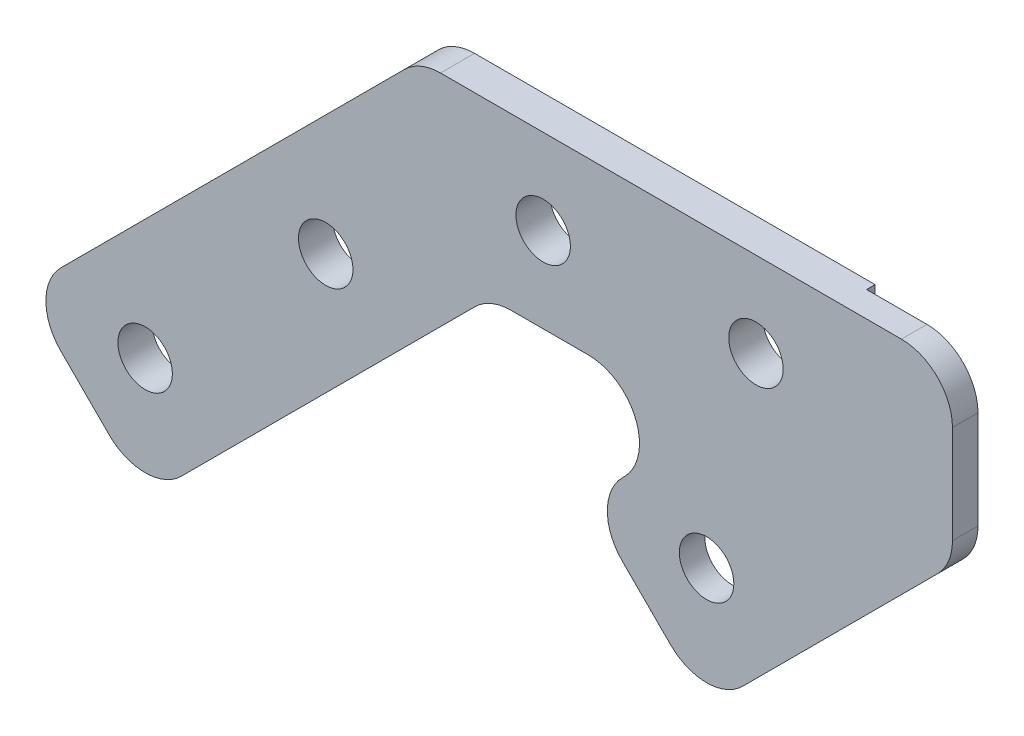
ISO-10303-21;
HEADER;
FILE_DESCRIPTION(('STEP AP214'),'2;1');
FILE_NAME('part.step','',(''),(''),'','','');
FILE_SCHEMA(('AUTOMOTIVE_DESIGN { 1 0 10303 214 1 1 1 1 }'));
ENDSEC;
DATA;
#1=APPLICATION_CONTEXT('core data for automotive mechanical design processes');
#2=APPLICATION_PROTOCOL_DEFINITION('international standard','automotive_design',2000,#1);
#3=PRODUCT_CONTEXT('',#1,'mechanical');
#4=PRODUCT('Part','Part','',(#3));
#5=PRODUCT_RELATED_PRODUCT_CATEGORY('part','',(#4));
#6=PRODUCT_DEFINITION_FORMATION('','',#4);
#7=PRODUCT_DEFINITION_CONTEXT('part definition',#1,'design');
#8=PRODUCT_DEFINITION('design','',#6,#7);
#9=PRODUCT_DEFINITION_SHAPE('','',#8);
#10=(LENGTH_UNIT() NAMED_UNIT(*) SI_UNIT(.MILLI.,.METRE.));
#11=(NAMED_UNIT(*) PLANE_ANGLE_UNIT() SI_UNIT($,.RADIAN.));
#12=(NAMED_UNIT(*) SI_UNIT($,.STERADIAN.) SOLID_ANGLE_UNIT());
#13=UNCERTAINTY_MEASURE_WITH_UNIT(LENGTH_MEASURE(1.E-05),#10,'distance_accuracy_value','');
#14=(GEOMETRIC_REPRESENTATION_CONTEXT(3) GLOBAL_UNCERTAINTY_ASSIGNED_CONTEXT((#13)) GLOBAL_UNIT_ASSIGNED_CONTEXT((#10,
#11,#12)) REPRESENTATION_CONTEXT('',''));
#15=CARTESIAN_POINT('',(0.,0.,0.));
#16=DIRECTION('',(0.,0.,1.));
#17=DIRECTION('',(1.,0.,0.));
#18=AXIS2_PLACEMENT_3D('',#15,#16,#17);
#19=CARTESIAN_POINT('',(0.,0.,2.));
#20=DIRECTION('',(0.,1.,0.));
#21=DIRECTION('',(-1.,0.,0.));
#22=AXIS2_PLACEMENT_3D('',#19,#20,#21);
#23=PLANE('',#22);
#24=DIRECTION('',(1.,0.,0.));
#25=VECTOR('',#24,1.);
#26=CARTESIAN_POINT('',(0.,0.,2.));
#27=LINE('',#26,#25);
#28=CARTESIAN_POINT('',(1.24264068711928,0.,2.));
#29=VERTEX_POINT('',#28);
#30=CARTESIAN_POINT('',(5.78629150101195,0.,2.));
#31=VERTEX_POINT('',#30);
#32=EDGE_CURVE('E283',#29,#31,#27,.T.);
#33=ORIENTED_EDGE('',*,*,#32,.F.);
#34=DIRECTION('',(0.,0.,-1.));
#35=VECTOR('',#34,1.);
#36=CARTESIAN_POINT('',(1.24264068711928,0.,0.));
#37=LINE('',#36,#35);
#38=CARTESIAN_POINT('',(1.24264068711928,0.,0.));
#39=VERTEX_POINT('',#38);
#40=EDGE_CURVE('E271',#29,#39,#37,.T.);
#41=ORIENTED_EDGE('',*,*,#40,.T.);
#42=DIRECTION('',(1.,0.,0.));
#43=VECTOR('',#42,1.);
#44=CARTESIAN_POINT('',(0.,0.,0.));
#45=LINE('',#44,#43);
#46=CARTESIAN_POINT('',(20.6289321881429,0.,0.));
#47=VERTEX_POINT('',#46);
#48=EDGE_CURVE('E197',#39,#47,#45,.T.);
#49=ORIENTED_EDGE('',*,*,#48,.T.);
#50=DIRECTION('',(0.,0.,-1.));
#51=VECTOR('',#50,1.);
#52=CARTESIAN_POINT('',(20.6289321881429,0.,2.));
#53=LINE('',#52,#51);
#54=CARTESIAN_POINT('',(20.6289321881429,0.,0.5));
#55=VERTEX_POINT('',#54);
#56=EDGE_CURVE('E189',#55,#47,#53,.T.);
#57=ORIENTED_EDGE('',*,*,#56,.F.);
#58=DIRECTION('',(1.,0.,0.));
#59=VECTOR('',#58,1.);
#60=CARTESIAN_POINT('',(0.,0.,0.5));
#61=LINE('',#60,#59);
#62=CARTESIAN_POINT('',(5.78629150101195,0.,0.5));
#63=VERTEX_POINT('',#62);
#64=EDGE_CURVE('E52',#63,#55,#61,.T.);
#65=ORIENTED_EDGE('',*,*,#64,.F.);
#66=DIRECTION('',(0.,0.,1.));
#67=VECTOR('',#66,1.);
#68=CARTESIAN_POINT('',(5.78629150101195,0.,2.));
#69=LINE('',#68,#67);
#70=EDGE_CURVE('E269',#63,#31,#69,.T.);
#71=ORIENTED_EDGE('',*,*,#70,.T.);
#72=EDGE_LOOP('',(#33,#41,#49,#57,#65,#71));
#73=FACE_BOUND('',#72,.T.);
#74=ADVANCED_FACE('F37',(#73),#23,.F.);
#75=CARTESIAN_POINT('',(20.6289321881429,0.,2.));
#76=DIRECTION('',(-1.,0.,0.));
#77=DIRECTION('',(0.,0.,1.));
#78=AXIS2_PLACEMENT_3D('',#75,#76,#77);
#79=PLANE('',#78);
#80=DIRECTION('',(0.,1.,0.));
#81=VECTOR('',#80,1.);
#82=CARTESIAN_POINT('',(20.6289321881429,0.,0.5));
#83=LINE('',#82,#81);
#84=CARTESIAN_POINT('',(20.6289321881429,10.,0.5));
#85=VERTEX_POINT('',#84);
#86=EDGE_CURVE('E179',#55,#85,#83,.T.);
#87=ORIENTED_EDGE('',*,*,#86,.F.);
#88=ORIENTED_EDGE('',*,*,#56,.T.);
#89=DIRECTION('',(0.,1.,0.));
#90=VECTOR('',#89,1.);
#91=CARTESIAN_POINT('',(20.6289321881429,0.,0.));
#92=LINE('',#91,#90);
#93=CARTESIAN_POINT('',(20.6289321881429,10.,0.));
#94=VERTEX_POINT('',#93);
#95=EDGE_CURVE('E310',#47,#94,#92,.T.);
#96=ORIENTED_EDGE('',*,*,#95,.T.);
#97=DIRECTION('',(0.,0.,-1.));
#98=VECTOR('',#97,1.);
#99=CARTESIAN_POINT('',(20.6289321881429,10.,2.));
#100=LINE('',#99,#98);
#101=EDGE_CURVE('E191',#85,#94,#100,.T.);
#102=ORIENTED_EDGE('',*,*,#101,.F.);
#103=EDGE_LOOP('',(#87,#88,#96,#102));
#104=FACE_BOUND('',#103,.T.);
#105=ADVANCED_FACE('F187',(#104),#79,.F.);
#106=CARTESIAN_POINT('',(0.,0.,2.));
#107=DIRECTION('',(0.,0.,1.));
#108=DIRECTION('',(1.,0.,0.));
#109=AXIS2_PLACEMENT_3D('',#106,#107,#108);
#110=PLANE('',#109);
#111=CARTESIAN_POINT('',(-20.2512626584666,-13.1801948466011,2.));
#112=DIRECTION('',(0.,0.,1.));
#113=DIRECTION('',(1.,0.,0.));
#114=AXIS2_PLACEMENT_3D('',#111,#112,#113);
#115=CIRCLE('',#114,1.6);
#116=CARTESIAN_POINT('',(-18.6512626584666,-13.1801948466011,2.));
#117=VERTEX_POINT('',#116);
#118=EDGE_CURVE('E349',#117,#117,#115,.T.);
#119=ORIENTED_EDGE('',*,*,#118,.F.);
#120=EDGE_LOOP('',(#119));
#121=FACE_BOUND('',#120,.T.);
#122=CARTESIAN_POINT('',(3.12893218814291,5.,2.));
#123=DIRECTION('',(0.,0.,1.));
#124=DIRECTION('',(1.,0.,0.));
#125=AXIS2_PLACEMENT_3D('',#122,#123,#124);
#126=CIRCLE('',#125,1.6);
#127=CARTESIAN_POINT('',(4.72893218814291,5.,2.));
#128=VERTEX_POINT('',#127);
#129=EDGE_CURVE('E336',#128,#128,#126,.T.);
#130=ORIENTED_EDGE('',*,*,#129,.F.);
#131=EDGE_LOOP('',(#130));
#132=FACE_BOUND('',#131,.T.);
#133=DIRECTION('',(0.707106781186547,-0.707106781186547,0.));
#134=VECTOR('',#133,1.);
#135=CARTESIAN_POINT('',(-27.3223304703321,-13.1801948466011,2.));
#136=LINE('',#135,#134);
#137=CARTESIAN_POINT('',(-25.2010101267724,-15.3015151901607,2.));
#138=VERTEX_POINT('',#137);
#139=CARTESIAN_POINT('',(-22.3725830020262,-18.1299423149069,2.));
#140=VERTEX_POINT('',#139);
#141=EDGE_CURVE('E324',#138,#140,#136,.T.);
#142=ORIENTED_EDGE('',*,*,#141,.T.);
#143=CARTESIAN_POINT('',(-20.2512626584666,-16.0086219713473,2.));
#144=DIRECTION('',(0.,0.,1.));
#145=DIRECTION('',(1.,0.,0.));
#146=AXIS2_PLACEMENT_3D('',#143,#144,#145);
#147=CIRCLE('',#146,3.);
#148=CARTESIAN_POINT('',(-18.1299423149069,-18.1299423149069,2.));
#149=VERTEX_POINT('',#148);
#150=EDGE_CURVE('E231',#140,#149,#147,.T.);
#151=ORIENTED_EDGE('',*,*,#150,.T.);
#152=DIRECTION('',(0.707106781186548,0.707106781186548,0.));
#153=VECTOR('',#152,1.);
#154=CARTESIAN_POINT('',(-20.2512626584666,-20.2512626584666,2.));
#155=LINE('',#154,#153);
#156=CARTESIAN_POINT('',(-0.878679656440354,-0.878679656440354,2.));
#157=VERTEX_POINT('',#156);
#158=EDGE_CURVE('E291',#149,#157,#155,.T.);
#159=ORIENTED_EDGE('',*,*,#158,.T.);
#160=CARTESIAN_POINT('',(1.24264068711928,-3.,2.));
#161=DIRECTION('',(0.,0.,1.));
#162=DIRECTION('',(1.,0.,0.));
#163=AXIS2_PLACEMENT_3D('',#160,#161,#162);
#164=CIRCLE('',#163,3.);
#165=EDGE_CURVE('E275',#157,#29,#164,.F.);
#166=ORIENTED_EDGE('',*,*,#165,.T.);
#167=ORIENTED_EDGE('',*,*,#32,.T.);
#168=CARTESIAN_POINT('',(5.78629150101195,-3.,2.));
#169=DIRECTION('',(0.,0.,1.));
#170=DIRECTION('',(1.,0.,0.));
#171=AXIS2_PLACEMENT_3D('',#168,#169,#170);
#172=CIRCLE('',#171,3.);
#173=CARTESIAN_POINT('',(7.90761184457165,-5.12132034355958,2.));
#174=VERTEX_POINT('',#173);
#175=EDGE_CURVE('E45',#31,#174,#172,.F.);
#176=ORIENTED_EDGE('',*,*,#175,.T.);
#177=DIRECTION('',(0.707106781186528,0.707106781186567,0.));
#178=VECTOR('',#177,1.);
#179=CARTESIAN_POINT('',(6.51446609406584,-6.51446609406548,2.));
#180=LINE('',#179,#178);
#181=CARTESIAN_POINT('',(7.7776695296604,-5.25126265847084,2.));
#182=VERTEX_POINT('',#181);
#183=EDGE_CURVE('E282',#182,#174,#180,.T.);
#184=ORIENTED_EDGE('',*,*,#183,.F.);
#185=CARTESIAN_POINT('',(9.8989898732201,-7.37258300203043,2.));
#186=DIRECTION('',(0.,0.,1.));
#187=DIRECTION('',(1.,0.,0.));
#188=AXIS2_PLACEMENT_3D('',#185,#186,#187);
#189=CIRCLE('',#188,3.);
#190=CARTESIAN_POINT('',(7.77766952966047,-9.49390334559008,2.));
#191=VERTEX_POINT('',#190);
#192=EDGE_CURVE('E219',#182,#191,#189,.T.);
#193=ORIENTED_EDGE('',*,*,#192,.T.);
#194=DIRECTION('',(0.707106781186551,-0.707106781186544,0.));
#195=VECTOR('',#194,1.);
#196=CARTESIAN_POINT('',(-0.858116907964844,-0.858116907964853,2.));
#197=LINE('',#196,#195);
#198=CARTESIAN_POINT('',(10.6060966544068,-12.3223304703363,2.));
#199=VERTEX_POINT('',#198);
#200=EDGE_CURVE('E287',#191,#199,#197,.T.);
#201=ORIENTED_EDGE('',*,*,#200,.T.);
#202=CARTESIAN_POINT('',(12.7274169979664,-10.2010101267767,2.));
#203=DIRECTION('',(0.,0.,1.));
#204=DIRECTION('',(1.,0.,0.));
#205=AXIS2_PLACEMENT_3D('',#202,#203,#204);
#206=CIRCLE('',#205,3.);
#207=CARTESIAN_POINT('',(14.848737341526,-12.3223304703363,2.));
#208=VERTEX_POINT('',#207);
#209=EDGE_CURVE('E221',#199,#208,#206,.T.);
#210=ORIENTED_EDGE('',*,*,#209,.T.);
#211=DIRECTION('',(0.707106781186542,0.707106781186553,0.));
#212=VECTOR('',#211,1.);
#213=CARTESIAN_POINT('',(13.5855339059313,-13.5855339059311,2.));
#214=LINE('',#213,#212);
#215=CARTESIAN_POINT('',(26.2923881554221,-0.878679656440005,2.));
#216=VERTEX_POINT('',#215);
#217=EDGE_CURVE('E364',#208,#216,#214,.T.);
#218=ORIENTED_EDGE('',*,*,#217,.T.);
#219=CARTESIAN_POINT('',(24.1710678118625,1.24264068711962,2.));
#220=DIRECTION('',(0.,0.,1.));
#221=DIRECTION('',(1.,0.,0.));
#222=AXIS2_PLACEMENT_3D('',#219,#220,#221);
#223=CIRCLE('',#222,3.);
#224=CARTESIAN_POINT('',(27.1710678118625,1.24264068711962,2.));
#225=VERTEX_POINT('',#224);
#226=EDGE_CURVE('E225',#216,#225,#223,.T.);
#227=ORIENTED_EDGE('',*,*,#226,.T.);
#228=DIRECTION('',(0.,1.,0.));
#229=VECTOR('',#228,1.);
#230=CARTESIAN_POINT('',(27.1710678118625,0.,2.));
#231=LINE('',#230,#229);
#232=CARTESIAN_POINT('',(27.1710678118625,7.,2.));
#233=VERTEX_POINT('',#232);
#234=EDGE_CURVE('E288',#225,#233,#231,.T.);
#235=ORIENTED_EDGE('',*,*,#234,.T.);
#236=CARTESIAN_POINT('',(24.1710678118625,7.,2.));
#237=DIRECTION('',(0.,0.,1.));
#238=DIRECTION('',(1.,0.,0.));
#239=AXIS2_PLACEMENT_3D('',#236,#237,#238);
#240=CIRCLE('',#239,3.);
#241=CARTESIAN_POINT('',(24.1710678118625,10.,2.));
#242=VERTEX_POINT('',#241);
#243=EDGE_CURVE('E223',#233,#242,#240,.T.);
#244=ORIENTED_EDGE('',*,*,#243,.T.);
#245=DIRECTION('',(-1.,0.,0.));
#246=VECTOR('',#245,1.);
#247=CARTESIAN_POINT('',(20.6289321881429,10.,2.));
#248=LINE('',#247,#246);
#249=CARTESIAN_POINT('',(-2.89949493661167,9.99999999999999,2.));
#250=VERTEX_POINT('',#249);
#251=EDGE_CURVE('E202',#242,#250,#248,.T.);
#252=ORIENTED_EDGE('',*,*,#251,.T.);
#253=CARTESIAN_POINT('',(-2.89949493661167,6.99999999999999,2.));
#254=DIRECTION('',(0.,0.,1.));
#255=DIRECTION('',(1.,0.,0.));
#256=AXIS2_PLACEMENT_3D('',#253,#254,#255);
#257=CIRCLE('',#256,3.);
#258=CARTESIAN_POINT('',(-5.02081528017131,9.12132034355964,2.));
#259=VERTEX_POINT('',#258);
#260=EDGE_CURVE('E227',#250,#259,#257,.T.);
#261=ORIENTED_EDGE('',*,*,#260,.T.);
#262=DIRECTION('',(-0.707106781186548,-0.707106781186548,0.));
#263=VECTOR('',#262,1.);
#264=CARTESIAN_POINT('',(-4.14213562373095,9.99999999999999,2.));
#265=LINE('',#264,#263);
#266=CARTESIAN_POINT('',(-25.2010101267724,-11.0588745030415,2.));
#267=VERTEX_POINT('',#266);
#268=EDGE_CURVE('E319',#259,#267,#265,.T.);
#269=ORIENTED_EDGE('',*,*,#268,.T.);
#270=CARTESIAN_POINT('',(-23.0796897832128,-13.1801948466011,2.));
#271=DIRECTION('',(0.,0.,1.));
#272=DIRECTION('',(1.,0.,0.));
#273=AXIS2_PLACEMENT_3D('',#270,#271,#272);
#274=CIRCLE('',#273,3.);
#275=EDGE_CURVE('E229',#267,#138,#274,.T.);
#276=ORIENTED_EDGE('',*,*,#275,.T.);
#277=EDGE_LOOP('',(#142,#151,#159,#166,#167,#176,#184,#193,#201,#210,#218,#227,#235,#244,#252,
#261,#269,#276));
#278=FACE_BOUND('',#277,.T.);
#279=CARTESIAN_POINT('',(15.6289321881429,5.,2.));
#280=DIRECTION('',(0.,0.,1.));
#281=DIRECTION('',(1.,0.,0.));
#282=AXIS2_PLACEMENT_3D('',#279,#280,#281);
#283=CIRCLE('',#282,1.6);
#284=CARTESIAN_POINT('',(17.2289321881429,5.,2.));
#285=VERTEX_POINT('',#284);
#286=EDGE_CURVE('E344',#285,#285,#283,.T.);
#287=ORIENTED_EDGE('',*,*,#286,.F.);
#288=EDGE_LOOP('',(#287));
#289=FACE_BOUND('',#288,.T.);
#290=CARTESIAN_POINT('',(-9.64466094066837,-2.57359312880289,2.));
#291=DIRECTION('',(0.,0.,1.));
#292=DIRECTION('',(1.,0.,0.));
#293=AXIS2_PLACEMENT_3D('',#290,#291,#292);
#294=CIRCLE('',#293,1.6);
#295=CARTESIAN_POINT('',(-8.04466094066837,-2.57359312880289,2.));
#296=VERTEX_POINT('',#295);
#297=EDGE_CURVE('E355',#296,#296,#294,.T.);
#298=ORIENTED_EDGE('',*,*,#297,.F.);
#299=EDGE_LOOP('',(#298));
#300=FACE_BOUND('',#299,.T.);
#301=CARTESIAN_POINT('',(12.7274169979661,-7.37258300203105,2.));
#302=DIRECTION('',(0.,0.,1.));
#303=DIRECTION('',(1.,0.,0.));
#304=AXIS2_PLACEMENT_3D('',#301,#302,#303);
#305=CIRCLE('',#304,1.60000000000019);
#306=CARTESIAN_POINT('',(14.3274169979663,-7.37258300203105,2.));
#307=VERTEX_POINT('',#306);
#308=EDGE_CURVE('E372',#307,#307,#305,.T.);
#309=ORIENTED_EDGE('',*,*,#308,.F.);
#310=EDGE_LOOP('',(#309));
#311=FACE_BOUND('',#310,.T.);
#312=ADVANCED_FACE('F280',(#121,#132,#278,#289,#300,#311),#110,.T.);
#313=CARTESIAN_POINT('',(0.,0.,0.));
#314=DIRECTION('',(0.,0.,1.));
#315=DIRECTION('',(1.,0.,0.));
#316=AXIS2_PLACEMENT_3D('',#313,#314,#315);
#317=PLANE('',#316);
#318=DIRECTION('',(0.707106781186548,0.707106781186548,0.));
#319=VECTOR('',#318,1.);
#320=CARTESIAN_POINT('',(-20.2512626584666,-20.2512626584666,0.));
#321=LINE('',#320,#319);
#322=CARTESIAN_POINT('',(-18.1299423149069,-18.1299423149069,0.));
#323=VERTEX_POINT('',#322);
#324=CARTESIAN_POINT('',(-0.878679656440354,-0.878679656440354,0.));
#325=VERTEX_POINT('',#324);
#326=EDGE_CURVE('E302',#323,#325,#321,.T.);
#327=ORIENTED_EDGE('',*,*,#326,.F.);
#328=CARTESIAN_POINT('',(-20.2512626584666,-16.0086219713473,0.));
#329=DIRECTION('',(0.,0.,1.));
#330=DIRECTION('',(1.,0.,0.));
#331=AXIS2_PLACEMENT_3D('',#328,#329,#330);
#332=CIRCLE('',#331,3.);
#333=CARTESIAN_POINT('',(-22.3725830020262,-18.1299423149069,0.));
#334=VERTEX_POINT('',#333);
#335=EDGE_CURVE('E212',#323,#334,#332,.F.);
#336=ORIENTED_EDGE('',*,*,#335,.T.);
#337=DIRECTION('',(0.707106781186547,-0.707106781186547,0.));
#338=VECTOR('',#337,1.);
#339=CARTESIAN_POINT('',(-27.3223304703321,-13.1801948466011,0.));
#340=LINE('',#339,#338);
#341=CARTESIAN_POINT('',(-25.2010101267724,-15.3015151901607,0.));
#342=VERTEX_POINT('',#341);
#343=EDGE_CURVE('E308',#342,#334,#340,.T.);
#344=ORIENTED_EDGE('',*,*,#343,.F.);
#345=CARTESIAN_POINT('',(-23.0796897832128,-13.1801948466011,0.));
#346=DIRECTION('',(0.,0.,1.));
#347=DIRECTION('',(1.,0.,0.));
#348=AXIS2_PLACEMENT_3D('',#345,#346,#347);
#349=CIRCLE('',#348,3.);
#350=CARTESIAN_POINT('',(-25.2010101267724,-11.0588745030415,0.));
#351=VERTEX_POINT('',#350);
#352=EDGE_CURVE('E210',#342,#351,#349,.F.);
#353=ORIENTED_EDGE('',*,*,#352,.T.);
#354=DIRECTION('',(-0.707106781186548,-0.707106781186548,0.));
#355=VECTOR('',#354,1.);
#356=CARTESIAN_POINT('',(-4.14213562373095,9.99999999999999,0.));
#357=LINE('',#356,#355);
#358=CARTESIAN_POINT('',(-5.02081528017131,9.12132034355964,0.));
#359=VERTEX_POINT('',#358);
#360=EDGE_CURVE('E313',#359,#351,#357,.T.);
#361=ORIENTED_EDGE('',*,*,#360,.F.);
#362=CARTESIAN_POINT('',(-2.89949493661167,6.99999999999999,0.));
#363=DIRECTION('',(0.,0.,1.));
#364=DIRECTION('',(1.,0.,0.));
#365=AXIS2_PLACEMENT_3D('',#362,#363,#364);
#366=CIRCLE('',#365,3.);
#367=CARTESIAN_POINT('',(-2.89949493661167,9.99999999999999,0.));
#368=VERTEX_POINT('',#367);
#369=EDGE_CURVE('E208',#359,#368,#366,.F.);
#370=ORIENTED_EDGE('',*,*,#369,.T.);
#371=DIRECTION('',(-1.,0.,0.));
#372=VECTOR('',#371,1.);
#373=CARTESIAN_POINT('',(20.6289321881429,10.,0.));
#374=LINE('',#373,#372);
#375=EDGE_CURVE('E317',#94,#368,#374,.T.);
#376=ORIENTED_EDGE('',*,*,#375,.F.);
#377=ORIENTED_EDGE('',*,*,#95,.F.);
#378=ORIENTED_EDGE('',*,*,#48,.F.);
#379=CARTESIAN_POINT('',(1.24264068711928,-3.,0.));
#380=DIRECTION('',(0.,0.,1.));
#381=DIRECTION('',(1.,0.,0.));
#382=AXIS2_PLACEMENT_3D('',#379,#380,#381);
#383=CIRCLE('',#382,3.);
#384=EDGE_CURVE('E273',#39,#325,#383,.T.);
#385=ORIENTED_EDGE('',*,*,#384,.T.);
#386=EDGE_LOOP('',(#327,#336,#344,#353,#361,#370,#376,#377,#378,#385));
#387=FACE_BOUND('',#386,.T.);
#388=CARTESIAN_POINT('',(3.12893218814291,5.,0.));
#389=DIRECTION('',(0.,0.,1.));
#390=DIRECTION('',(1.,0.,0.));
#391=AXIS2_PLACEMENT_3D('',#388,#389,#390);
#392=CIRCLE('',#391,1.6);
#393=CARTESIAN_POINT('',(4.72893218814291,5.,0.));
#394=VERTEX_POINT('',#393);
#395=EDGE_CURVE('E330',#394,#394,#392,.T.);
#396=ORIENTED_EDGE('',*,*,#395,.T.);
#397=EDGE_LOOP('',(#396));
#398=FACE_BOUND('',#397,.T.);
#399=CARTESIAN_POINT('',(15.6289321881429,5.,0.));
#400=DIRECTION('',(0.,0.,1.));
#401=DIRECTION('',(1.,0.,0.));
#402=AXIS2_PLACEMENT_3D('',#399,#400,#401);
#403=CIRCLE('',#402,1.6);
#404=CARTESIAN_POINT('',(17.2289321881429,5.,0.));
#405=VERTEX_POINT('',#404);
#406=EDGE_CURVE('E346',#405,#405,#403,.T.);
#407=ORIENTED_EDGE('',*,*,#406,.T.);
#408=EDGE_LOOP('',(#407));
#409=FACE_BOUND('',#408,.T.);
#410=CARTESIAN_POINT('',(-20.2512626584666,-13.1801948466011,0.));
#411=DIRECTION('',(0.,0.,1.));
#412=DIRECTION('',(1.,0.,0.));
#413=AXIS2_PLACEMENT_3D('',#410,#411,#412);
#414=CIRCLE('',#413,1.6);
#415=CARTESIAN_POINT('',(-18.6512626584666,-13.1801948466011,0.));
#416=VERTEX_POINT('',#415);
#417=EDGE_CURVE('E352',#416,#416,#414,.T.);
#418=ORIENTED_EDGE('',*,*,#417,.T.);
#419=EDGE_LOOP('',(#418));
#420=FACE_BOUND('',#419,.T.);
#421=CARTESIAN_POINT('',(-9.64466094066837,-2.57359312880289,0.));
#422=DIRECTION('',(0.,0.,1.));
#423=DIRECTION('',(1.,0.,0.));
#424=AXIS2_PLACEMENT_3D('',#421,#422,#423);
#425=CIRCLE('',#424,1.6);
#426=CARTESIAN_POINT('',(-8.04466094066837,-2.57359312880289,0.));
#427=VERTEX_POINT('',#426);
#428=EDGE_CURVE('E358',#427,#427,#425,.T.);
#429=ORIENTED_EDGE('',*,*,#428,.T.);
#430=EDGE_LOOP('',(#429));
#431=FACE_BOUND('',#430,.T.);
#432=ADVANCED_FACE('F300',(#387,#398,#409,#420,#431),#317,.F.);
#433=CARTESIAN_POINT('',(-4.14213562373095,9.99999999999999,2.));
#434=DIRECTION('',(0.707106781186547,-0.707106781186547,0.));
#435=DIRECTION('',(0.707106781186548,0.707106781186548,0.));
#436=AXIS2_PLACEMENT_3D('',#433,#434,#435);
#437=PLANE('',#436);
#438=ORIENTED_EDGE('',*,*,#360,.T.);
#439=DIRECTION('',(0.,0.,-1.));
#440=VECTOR('',#439,1.);
#441=CARTESIAN_POINT('',(-25.2010101267724,-11.0588745030415,2.));
#442=LINE('',#441,#440);
#443=EDGE_CURVE('E236',#351,#267,#442,.F.);
#444=ORIENTED_EDGE('',*,*,#443,.T.);
#445=ORIENTED_EDGE('',*,*,#268,.F.);
#446=DIRECTION('',(0.,0.,-1.));
#447=VECTOR('',#446,1.);
#448=CARTESIAN_POINT('',(-5.02081528017131,9.12132034355964,2.));
#449=LINE('',#448,#447);
#450=EDGE_CURVE('E233',#259,#359,#449,.T.);
#451=ORIENTED_EDGE('',*,*,#450,.T.);
#452=EDGE_LOOP('',(#438,#444,#445,#451));
#453=FACE_BOUND('',#452,.T.);
#454=ADVANCED_FACE('F402',(#453),#437,.F.);
#455=CARTESIAN_POINT('',(-27.3223304703321,-13.1801948466011,2.));
#456=DIRECTION('',(0.707106781186547,0.707106781186547,0.));
#457=DIRECTION('',(-0.707106781186548,0.707106781186548,0.));
#458=AXIS2_PLACEMENT_3D('',#455,#456,#457);
#459=PLANE('',#458);
#460=ORIENTED_EDGE('',*,*,#343,.T.);
#461=DIRECTION('',(0.,0.,-1.));
#462=VECTOR('',#461,1.);
#463=CARTESIAN_POINT('',(-22.3725830020262,-18.1299423149069,2.));
#464=LINE('',#463,#462);
#465=EDGE_CURVE('E217',#334,#140,#464,.F.);
#466=ORIENTED_EDGE('',*,*,#465,.T.);
#467=ORIENTED_EDGE('',*,*,#141,.F.);
#468=DIRECTION('',(0.,0.,-1.));
#469=VECTOR('',#468,1.);
#470=CARTESIAN_POINT('',(-25.2010101267724,-15.3015151901607,2.));
#471=LINE('',#470,#469);
#472=EDGE_CURVE('E214',#138,#342,#471,.T.);
#473=ORIENTED_EDGE('',*,*,#472,.T.);
#474=EDGE_LOOP('',(#460,#466,#467,#473));
#475=FACE_BOUND('',#474,.T.);
#476=ADVANCED_FACE('F417',(#475),#459,.F.);
#477=CARTESIAN_POINT('',(-20.2512626584666,-20.2512626584666,2.));
#478=DIRECTION('',(-0.707106781186547,0.707106781186547,0.));
#479=DIRECTION('',(-0.707106781186548,-0.707106781186548,0.));
#480=AXIS2_PLACEMENT_3D('',#477,#478,#479);
#481=PLANE('',#480);
#482=ORIENTED_EDGE('',*,*,#158,.F.);
#483=DIRECTION('',(0.,0.,-1.));
#484=VECTOR('',#483,1.);
#485=CARTESIAN_POINT('',(-18.1299423149069,-18.1299423149069,2.));
#486=LINE('',#485,#484);
#487=EDGE_CURVE('E200',#149,#323,#486,.T.);
#488=ORIENTED_EDGE('',*,*,#487,.T.);
#489=ORIENTED_EDGE('',*,*,#326,.T.);
#490=DIRECTION('',(0.,0.,-1.));
#491=VECTOR('',#490,1.);
#492=CARTESIAN_POINT('',(-0.878679656440357,-0.878679656440358,2.));
#493=LINE('',#492,#491);
#494=EDGE_CURVE('E198',#325,#157,#493,.F.);
#495=ORIENTED_EDGE('',*,*,#494,.T.);
#496=EDGE_LOOP('',(#482,#488,#489,#495));
#497=FACE_BOUND('',#496,.T.);
#498=ADVANCED_FACE('F305',(#497),#481,.F.);
#499=CARTESIAN_POINT('',(20.6289321881429,10.,2.));
#500=DIRECTION('',(0.,-1.,0.));
#501=DIRECTION('',(1.,0.,0.));
#502=AXIS2_PLACEMENT_3D('',#499,#500,#501);
#503=PLANE('',#502);
#504=ORIENTED_EDGE('',*,*,#375,.T.);
#505=DIRECTION('',(0.,0.,-1.));
#506=VECTOR('',#505,1.);
#507=CARTESIAN_POINT('',(-2.89949493661167,9.99999999999999,2.));
#508=LINE('',#507,#506);
#509=EDGE_CURVE('E240',#368,#250,#508,.F.);
#510=ORIENTED_EDGE('',*,*,#509,.T.);
#511=ORIENTED_EDGE('',*,*,#251,.F.);
#512=DIRECTION('',(0.,0.,1.));
#513=VECTOR('',#512,1.);
#514=CARTESIAN_POINT('',(24.1710678118625,10.,0.5));
#515=LINE('',#514,#513);
#516=CARTESIAN_POINT('',(24.1710678118625,10.0000000000002,0.5));
#517=VERTEX_POINT('',#516);
#518=EDGE_CURVE('E238',#242,#517,#515,.F.);
#519=ORIENTED_EDGE('',*,*,#518,.T.);
#520=DIRECTION('',(-1.,0.,0.));
#521=VECTOR('',#520,1.);
#522=CARTESIAN_POINT('',(-1.48911083303837E-13,9.99999999999981,0.5));
#523=LINE('',#522,#521);
#524=EDGE_CURVE('E192',#517,#85,#523,.T.);
#525=ORIENTED_EDGE('',*,*,#524,.T.);
#526=ORIENTED_EDGE('',*,*,#101,.T.);
#527=EDGE_LOOP('',(#504,#510,#511,#519,#525,#526));
#528=FACE_BOUND('',#527,.T.);
#529=ADVANCED_FACE('F416',(#528),#503,.F.);
#530=CARTESIAN_POINT('',(3.12893218814291,5.,2.));
#531=DIRECTION('',(0.,0.,-1.));
#532=DIRECTION('',(-1.,0.,0.));
#533=AXIS2_PLACEMENT_3D('',#530,#531,#532);
#534=CYLINDRICAL_SURFACE('',#533,1.6);
#535=ORIENTED_EDGE('',*,*,#129,.T.);
#536=EDGE_LOOP('',(#535));
#537=FACE_BOUND('',#536,.T.);
#538=ORIENTED_EDGE('',*,*,#395,.F.);
#539=EDGE_LOOP('',(#538));
#540=FACE_BOUND('',#539,.T.);
#541=ADVANCED_FACE('F560',(#537,#540),#534,.F.);
#542=CARTESIAN_POINT('',(15.6289321881429,5.,2.));
#543=DIRECTION('',(0.,0.,-1.));
#544=DIRECTION('',(-1.,0.,0.));
#545=AXIS2_PLACEMENT_3D('',#542,#543,#544);
#546=CYLINDRICAL_SURFACE('',#545,1.6);
#547=ORIENTED_EDGE('',*,*,#286,.T.);
#548=EDGE_LOOP('',(#547));
#549=FACE_BOUND('',#548,.T.);
#550=ORIENTED_EDGE('',*,*,#406,.F.);
#551=EDGE_LOOP('',(#550));
#552=FACE_BOUND('',#551,.T.);
#553=ADVANCED_FACE('F623',(#549,#552),#546,.F.);
#554=CARTESIAN_POINT('',(-20.2512626584666,-13.1801948466011,2.));
#555=DIRECTION('',(0.,0.,-1.));
#556=DIRECTION('',(-1.,0.,0.));
#557=AXIS2_PLACEMENT_3D('',#554,#555,#556);
#558=CYLINDRICAL_SURFACE('',#557,1.6);
#559=ORIENTED_EDGE('',*,*,#118,.T.);
#560=EDGE_LOOP('',(#559));
#561=FACE_BOUND('',#560,.T.);
#562=ORIENTED_EDGE('',*,*,#417,.F.);
#563=EDGE_LOOP('',(#562));
#564=FACE_BOUND('',#563,.T.);
#565=ADVANCED_FACE('F613',(#561,#564),#558,.F.);
#566=CARTESIAN_POINT('',(-9.64466094066837,-2.57359312880289,2.));
#567=DIRECTION('',(0.,0.,-1.));
#568=DIRECTION('',(-1.,0.,0.));
#569=AXIS2_PLACEMENT_3D('',#566,#567,#568);
#570=CYLINDRICAL_SURFACE('',#569,1.6);
#571=ORIENTED_EDGE('',*,*,#297,.T.);
#572=EDGE_LOOP('',(#571));
#573=FACE_BOUND('',#572,.T.);
#574=ORIENTED_EDGE('',*,*,#428,.F.);
#575=EDGE_LOOP('',(#574));
#576=FACE_BOUND('',#575,.T.);
#577=ADVANCED_FACE('F549',(#573,#576),#570,.F.);
#578=CARTESIAN_POINT('',(27.1710678118625,0.,0.5));
#579=DIRECTION('',(1.,0.,0.));
#580=DIRECTION('',(0.,0.,-1.));
#581=AXIS2_PLACEMENT_3D('',#578,#579,#580);
#582=PLANE('',#581);
#583=ORIENTED_EDGE('',*,*,#234,.F.);
#584=DIRECTION('',(0.,0.,1.));
#585=VECTOR('',#584,1.);
#586=CARTESIAN_POINT('',(27.1710678118625,1.24264068711962,0.5));
#587=LINE('',#586,#585);
#588=CARTESIAN_POINT('',(27.1710678118625,1.24264068711962,0.5));
#589=VERTEX_POINT('',#588);
#590=EDGE_CURVE('E250',#225,#589,#587,.F.);
#591=ORIENTED_EDGE('',*,*,#590,.T.);
#592=DIRECTION('',(0.,1.,0.));
#593=VECTOR('',#592,1.);
#594=CARTESIAN_POINT('',(27.1710678118625,0.,0.5));
#595=LINE('',#594,#593);
#596=CARTESIAN_POINT('',(27.1710678118625,7.,0.5));
#597=VERTEX_POINT('',#596);
#598=EDGE_CURVE('E382',#589,#597,#595,.T.);
#599=ORIENTED_EDGE('',*,*,#598,.T.);
#600=DIRECTION('',(0.,0.,1.));
#601=VECTOR('',#600,1.);
#602=CARTESIAN_POINT('',(27.1710678118625,7.,2.));
#603=LINE('',#602,#601);
#604=EDGE_CURVE('E247',#597,#233,#603,.T.);
#605=ORIENTED_EDGE('',*,*,#604,.T.);
#606=EDGE_LOOP('',(#583,#591,#599,#605));
#607=FACE_BOUND('',#606,.T.);
#608=ADVANCED_FACE('F539',(#607),#582,.T.);
#609=CARTESIAN_POINT('',(13.5855339059313,-13.5855339059311,0.5));
#610=DIRECTION('',(0.707106781186553,-0.707106781186542,0.));
#611=DIRECTION('',(0.707106781186542,0.707106781186553,0.));
#612=AXIS2_PLACEMENT_3D('',#609,#610,#611);
#613=PLANE('',#612);
#614=DIRECTION('',(0.707106781186542,0.707106781186553,0.));
#615=VECTOR('',#614,1.);
#616=CARTESIAN_POINT('',(13.5855339059313,-13.5855339059311,0.5));
#617=LINE('',#616,#615);
#618=CARTESIAN_POINT('',(14.848737341526,-12.3223304703363,0.5));
#619=VERTEX_POINT('',#618);
#620=CARTESIAN_POINT('',(26.2923881554221,-0.878679656440005,0.5));
#621=VERTEX_POINT('',#620);
#622=EDGE_CURVE('E361',#619,#621,#617,.T.);
#623=ORIENTED_EDGE('',*,*,#622,.T.);
#624=DIRECTION('',(0.,0.,1.));
#625=VECTOR('',#624,1.);
#626=CARTESIAN_POINT('',(26.2923881554221,-0.878679656440009,0.5));
#627=LINE('',#626,#625);
#628=EDGE_CURVE('E244',#621,#216,#627,.T.);
#629=ORIENTED_EDGE('',*,*,#628,.T.);
#630=ORIENTED_EDGE('',*,*,#217,.F.);
#631=DIRECTION('',(0.,0.,1.));
#632=VECTOR('',#631,1.);
#633=CARTESIAN_POINT('',(14.848737341526,-12.3223304703363,0.5));
#634=LINE('',#633,#632);
#635=EDGE_CURVE('E242',#208,#619,#634,.F.);
#636=ORIENTED_EDGE('',*,*,#635,.T.);
#637=EDGE_LOOP('',(#623,#629,#630,#636));
#638=FACE_BOUND('',#637,.T.);
#639=ADVANCED_FACE('F529',(#638),#613,.T.);
#640=CARTESIAN_POINT('',(-0.858116907964844,-0.858116907964853,0.5));
#641=DIRECTION('',(-0.707106781186544,-0.707106781186551,0.));
#642=DIRECTION('',(0.707106781186551,-0.707106781186544,0.));
#643=AXIS2_PLACEMENT_3D('',#640,#641,#642);
#644=PLANE('',#643);
#645=DIRECTION('',(0.707106781186551,-0.707106781186544,0.));
#646=VECTOR('',#645,1.);
#647=CARTESIAN_POINT('',(-0.858116907964844,-0.858116907964853,0.5));
#648=LINE('',#647,#646);
#649=CARTESIAN_POINT('',(7.77766952966047,-9.49390334559008,0.5));
#650=VERTEX_POINT('',#649);
#651=CARTESIAN_POINT('',(10.6060966544068,-12.3223304703363,0.5));
#652=VERTEX_POINT('',#651);
#653=EDGE_CURVE('E377',#650,#652,#648,.T.);
#654=ORIENTED_EDGE('',*,*,#653,.T.);
#655=DIRECTION('',(0.,0.,1.));
#656=VECTOR('',#655,1.);
#657=CARTESIAN_POINT('',(10.6060966544068,-12.3223304703363,0.5));
#658=LINE('',#657,#656);
#659=EDGE_CURVE('E262',#652,#199,#658,.T.);
#660=ORIENTED_EDGE('',*,*,#659,.T.);
#661=ORIENTED_EDGE('',*,*,#200,.F.);
#662=DIRECTION('',(0.,0.,1.));
#663=VECTOR('',#662,1.);
#664=CARTESIAN_POINT('',(7.77766952966047,-9.49390334559008,0.5));
#665=LINE('',#664,#663);
#666=EDGE_CURVE('E260',#191,#650,#665,.F.);
#667=ORIENTED_EDGE('',*,*,#666,.T.);
#668=EDGE_LOOP('',(#654,#660,#661,#667));
#669=FACE_BOUND('',#668,.T.);
#670=ADVANCED_FACE('F520',(#669),#644,.T.);
#671=CARTESIAN_POINT('',(6.51446609406584,-6.51446609406548,0.5));
#672=DIRECTION('',(0.707106781186567,-0.707106781186528,0.));
#673=DIRECTION('',(0.707106781186528,0.707106781186567,0.));
#674=AXIS2_PLACEMENT_3D('',#671,#672,#673);
#675=PLANE('',#674);
#676=DIRECTION('',(0.707106781186528,0.707106781186567,0.));
#677=VECTOR('',#676,1.);
#678=CARTESIAN_POINT('',(6.51446609406584,-6.51446609406548,0.5));
#679=LINE('',#678,#677);
#680=CARTESIAN_POINT('',(7.7776695296604,-5.25126265847084,0.5));
#681=VERTEX_POINT('',#680);
#682=CARTESIAN_POINT('',(7.90761184457165,-5.12132034355958,0.5));
#683=VERTEX_POINT('',#682);
#684=EDGE_CURVE('E183',#681,#683,#679,.T.);
#685=ORIENTED_EDGE('',*,*,#684,.F.);
#686=DIRECTION('',(0.,0.,1.));
#687=VECTOR('',#686,1.);
#688=CARTESIAN_POINT('',(7.7776695296604,-5.25126265847084,2.));
#689=LINE('',#688,#687);
#690=EDGE_CURVE('E266',#681,#182,#689,.T.);
#691=ORIENTED_EDGE('',*,*,#690,.T.);
#692=ORIENTED_EDGE('',*,*,#183,.T.);
#693=DIRECTION('',(0.,0.,1.));
#694=VECTOR('',#693,1.);
#695=CARTESIAN_POINT('',(7.90761184457165,-5.12132034355958,0.5));
#696=LINE('',#695,#694);
#697=EDGE_CURVE('E59',#174,#683,#696,.F.);
#698=ORIENTED_EDGE('',*,*,#697,.T.);
#699=EDGE_LOOP('',(#685,#691,#692,#698));
#700=FACE_BOUND('',#699,.T.);
#701=ADVANCED_FACE('F285',(#700),#675,.F.);
#702=CARTESIAN_POINT('',(12.7274169979661,-7.37258300203105,0.5));
#703=DIRECTION('',(0.,0.,1.));
#704=DIRECTION('',(1.,0.,0.));
#705=AXIS2_PLACEMENT_3D('',#702,#703,#704);
#706=CYLINDRICAL_SURFACE('',#705,1.60000000000019);
#707=CARTESIAN_POINT('',(12.7274169979661,-7.37258300203105,0.5));
#708=DIRECTION('',(0.,0.,1.));
#709=DIRECTION('',(1.,0.,0.));
#710=AXIS2_PLACEMENT_3D('',#707,#708,#709);
#711=CIRCLE('',#710,1.60000000000019);
#712=CARTESIAN_POINT('',(14.3274169979663,-7.37258300203105,0.5));
#713=VERTEX_POINT('',#712);
#714=EDGE_CURVE('E367',#713,#713,#711,.T.);
#715=ORIENTED_EDGE('',*,*,#714,.F.);
#716=EDGE_LOOP('',(#715));
#717=FACE_BOUND('',#716,.T.);
#718=ORIENTED_EDGE('',*,*,#308,.T.);
#719=EDGE_LOOP('',(#718));
#720=FACE_BOUND('',#719,.T.);
#721=ADVANCED_FACE('F389',(#717,#720),#706,.F.);
#722=CARTESIAN_POINT('',(0.,0.,0.5));
#723=DIRECTION('',(0.,0.,1.));
#724=DIRECTION('',(1.,0.,0.));
#725=AXIS2_PLACEMENT_3D('',#722,#723,#724);
#726=PLANE('',#725);
#727=ORIENTED_EDGE('',*,*,#714,.T.);
#728=EDGE_LOOP('',(#727));
#729=FACE_BOUND('',#728,.T.);
#730=ORIENTED_EDGE('',*,*,#598,.F.);
#731=CARTESIAN_POINT('',(24.1710678118625,1.24264068711962,0.5));
#732=DIRECTION('',(0.,0.,1.));
#733=DIRECTION('',(1.,0.,0.));
#734=AXIS2_PLACEMENT_3D('',#731,#732,#733);
#735=CIRCLE('',#734,3.);
#736=EDGE_CURVE('E258',#589,#621,#735,.F.);
#737=ORIENTED_EDGE('',*,*,#736,.T.);
#738=ORIENTED_EDGE('',*,*,#622,.F.);
#739=CARTESIAN_POINT('',(12.7274169979664,-10.2010101267767,0.5));
#740=DIRECTION('',(0.,0.,1.));
#741=DIRECTION('',(1.,0.,0.));
#742=AXIS2_PLACEMENT_3D('',#739,#740,#741);
#743=CIRCLE('',#742,3.);
#744=EDGE_CURVE('E254',#619,#652,#743,.F.);
#745=ORIENTED_EDGE('',*,*,#744,.T.);
#746=ORIENTED_EDGE('',*,*,#653,.F.);
#747=CARTESIAN_POINT('',(9.8989898732201,-7.37258300203043,0.5));
#748=DIRECTION('',(0.,0.,1.));
#749=DIRECTION('',(1.,0.,0.));
#750=AXIS2_PLACEMENT_3D('',#747,#748,#749);
#751=CIRCLE('',#750,3.);
#752=EDGE_CURVE('E252',#650,#681,#751,.F.);
#753=ORIENTED_EDGE('',*,*,#752,.T.);
#754=ORIENTED_EDGE('',*,*,#684,.T.);
#755=CARTESIAN_POINT('',(5.78629150101195,-3.,0.5));
#756=DIRECTION('',(0.,0.,1.));
#757=DIRECTION('',(1.,0.,0.));
#758=AXIS2_PLACEMENT_3D('',#755,#756,#757);
#759=CIRCLE('',#758,3.);
#760=EDGE_CURVE('E11',#683,#63,#759,.T.);
#761=ORIENTED_EDGE('',*,*,#760,.T.);
#762=ORIENTED_EDGE('',*,*,#64,.T.);
#763=ORIENTED_EDGE('',*,*,#86,.T.);
#764=ORIENTED_EDGE('',*,*,#524,.F.);
#765=CARTESIAN_POINT('',(24.1710678118625,7.,0.5));
#766=DIRECTION('',(0.,0.,1.));
#767=DIRECTION('',(1.,0.,0.));
#768=AXIS2_PLACEMENT_3D('',#765,#766,#767);
#769=CIRCLE('',#768,3.);
#770=EDGE_CURVE('E256',#517,#597,#769,.F.);
#771=ORIENTED_EDGE('',*,*,#770,.T.);
#772=EDGE_LOOP('',(#730,#737,#738,#745,#746,#753,#754,#761,#762,#763,#764,#771));
#773=FACE_BOUND('',#772,.T.);
#774=ADVANCED_FACE('F177',(#729,#773),#726,.F.);
#775=CARTESIAN_POINT('',(-20.2512626584666,-16.0086219713473,2.));
#776=DIRECTION('',(0.,0.,-1.));
#777=DIRECTION('',(-1.,0.,0.));
#778=AXIS2_PLACEMENT_3D('',#775,#776,#777);
#779=CYLINDRICAL_SURFACE('',#778,3.);
#780=ORIENTED_EDGE('',*,*,#150,.F.);
#781=ORIENTED_EDGE('',*,*,#465,.F.);
#782=ORIENTED_EDGE('',*,*,#335,.F.);
#783=ORIENTED_EDGE('',*,*,#487,.F.);
#784=EDGE_LOOP('',(#780,#781,#782,#783));
#785=FACE_BOUND('',#784,.T.);
#786=ADVANCED_FACE('F423',(#785),#779,.T.);
#787=CARTESIAN_POINT('',(-23.0796897832128,-13.1801948466011,2.));
#788=DIRECTION('',(0.,0.,-1.));
#789=DIRECTION('',(-1.,0.,0.));
#790=AXIS2_PLACEMENT_3D('',#787,#788,#789);
#791=CYLINDRICAL_SURFACE('',#790,3.);
#792=ORIENTED_EDGE('',*,*,#275,.F.);
#793=ORIENTED_EDGE('',*,*,#443,.F.);
#794=ORIENTED_EDGE('',*,*,#352,.F.);
#795=ORIENTED_EDGE('',*,*,#472,.F.);
#796=EDGE_LOOP('',(#792,#793,#794,#795));
#797=FACE_BOUND('',#796,.T.);
#798=ADVANCED_FACE('F426',(#797),#791,.T.);
#799=CARTESIAN_POINT('',(-2.89949493661167,6.99999999999999,2.));
#800=DIRECTION('',(0.,0.,-1.));
#801=DIRECTION('',(-1.,0.,0.));
#802=AXIS2_PLACEMENT_3D('',#799,#800,#801);
#803=CYLINDRICAL_SURFACE('',#802,3.);
#804=ORIENTED_EDGE('',*,*,#260,.F.);
#805=ORIENTED_EDGE('',*,*,#509,.F.);
#806=ORIENTED_EDGE('',*,*,#369,.F.);
#807=ORIENTED_EDGE('',*,*,#450,.F.);
#808=EDGE_LOOP('',(#804,#805,#806,#807));
#809=FACE_BOUND('',#808,.T.);
#810=ADVANCED_FACE('F430',(#809),#803,.T.);
#811=CARTESIAN_POINT('',(24.1710678118625,1.24264068711962,0.5));
#812=DIRECTION('',(0.,0.,1.));
#813=DIRECTION('',(1.,0.,0.));
#814=AXIS2_PLACEMENT_3D('',#811,#812,#813);
#815=CYLINDRICAL_SURFACE('',#814,3.);
#816=ORIENTED_EDGE('',*,*,#736,.F.);
#817=ORIENTED_EDGE('',*,*,#590,.F.);
#818=ORIENTED_EDGE('',*,*,#226,.F.);
#819=ORIENTED_EDGE('',*,*,#628,.F.);
#820=EDGE_LOOP('',(#816,#817,#818,#819));
#821=FACE_BOUND('',#820,.T.);
#822=ADVANCED_FACE('F434',(#821),#815,.T.);
#823=CARTESIAN_POINT('',(24.1710678118625,7.,0.5));
#824=DIRECTION('',(0.,0.,-1.));
#825=DIRECTION('',(-1.,0.,0.));
#826=AXIS2_PLACEMENT_3D('',#823,#824,#825);
#827=CYLINDRICAL_SURFACE('',#826,3.);
#828=ORIENTED_EDGE('',*,*,#770,.F.);
#829=ORIENTED_EDGE('',*,*,#518,.F.);
#830=ORIENTED_EDGE('',*,*,#243,.F.);
#831=ORIENTED_EDGE('',*,*,#604,.F.);
#832=EDGE_LOOP('',(#828,#829,#830,#831));
#833=FACE_BOUND('',#832,.T.);
#834=ADVANCED_FACE('F438',(#833),#827,.T.);
#835=CARTESIAN_POINT('',(12.7274169979664,-10.2010101267767,0.5));
#836=DIRECTION('',(0.,0.,1.));
#837=DIRECTION('',(1.,0.,0.));
#838=AXIS2_PLACEMENT_3D('',#835,#836,#837);
#839=CYLINDRICAL_SURFACE('',#838,3.);
#840=ORIENTED_EDGE('',*,*,#744,.F.);
#841=ORIENTED_EDGE('',*,*,#635,.F.);
#842=ORIENTED_EDGE('',*,*,#209,.F.);
#843=ORIENTED_EDGE('',*,*,#659,.F.);
#844=EDGE_LOOP('',(#840,#841,#842,#843));
#845=FACE_BOUND('',#844,.T.);
#846=ADVANCED_FACE('F442',(#845),#839,.T.);
#847=CARTESIAN_POINT('',(9.8989898732201,-7.37258300203043,0.5));
#848=DIRECTION('',(0.,0.,-1.));
#849=DIRECTION('',(-1.,0.,0.));
#850=AXIS2_PLACEMENT_3D('',#847,#848,#849);
#851=CYLINDRICAL_SURFACE('',#850,3.);
#852=ORIENTED_EDGE('',*,*,#752,.F.);
#853=ORIENTED_EDGE('',*,*,#666,.F.);
#854=ORIENTED_EDGE('',*,*,#192,.F.);
#855=ORIENTED_EDGE('',*,*,#690,.F.);
#856=EDGE_LOOP('',(#852,#853,#854,#855));
#857=FACE_BOUND('',#856,.T.);
#858=ADVANCED_FACE('F446',(#857),#851,.T.);
#859=CARTESIAN_POINT('',(1.24264068711928,-3.,2.));
#860=DIRECTION('',(0.,0.,1.));
#861=DIRECTION('',(1.,0.,0.));
#862=AXIS2_PLACEMENT_3D('',#859,#860,#861);
#863=CYLINDRICAL_SURFACE('',#862,3.);
#864=ORIENTED_EDGE('',*,*,#165,.F.);
#865=ORIENTED_EDGE('',*,*,#494,.F.);
#866=ORIENTED_EDGE('',*,*,#384,.F.);
#867=ORIENTED_EDGE('',*,*,#40,.F.);
#868=EDGE_LOOP('',(#864,#865,#866,#867));
#869=FACE_BOUND('',#868,.T.);
#870=ADVANCED_FACE('F295',(#869),#863,.F.);
#871=CARTESIAN_POINT('',(5.78629150101195,-3.,2.));
#872=DIRECTION('',(0.,0.,-1.));
#873=DIRECTION('',(-1.,0.,0.));
#874=AXIS2_PLACEMENT_3D('',#871,#872,#873);
#875=CYLINDRICAL_SURFACE('',#874,3.);
#876=ORIENTED_EDGE('',*,*,#760,.F.);
#877=ORIENTED_EDGE('',*,*,#697,.F.);
#878=ORIENTED_EDGE('',*,*,#175,.F.);
#879=ORIENTED_EDGE('',*,*,#70,.F.);
#880=EDGE_LOOP('',(#876,#877,#878,#879));
#881=FACE_BOUND('',#880,.T.);
#882=ADVANCED_FACE('F39',(#881),#875,.F.);
#883=CLOSED_SHELL('',(#74,#105,#312,#432,#454,#476,#498,#529,#541,#553,#565,#577,#608,#639,#670,
#701,#721,#774,#786,#798,#810,#822,#834,#846,#858,#870,#882));
#884=MANIFOLD_SOLID_BREP('B2',#883);
#885=ADVANCED_BREP_SHAPE_REPRESENTATION('',(#18,#884),#14);
#886=SHAPE_DEFINITION_REPRESENTATION(#9,#885);
ENDSEC;
END-ISO-10303-21;
